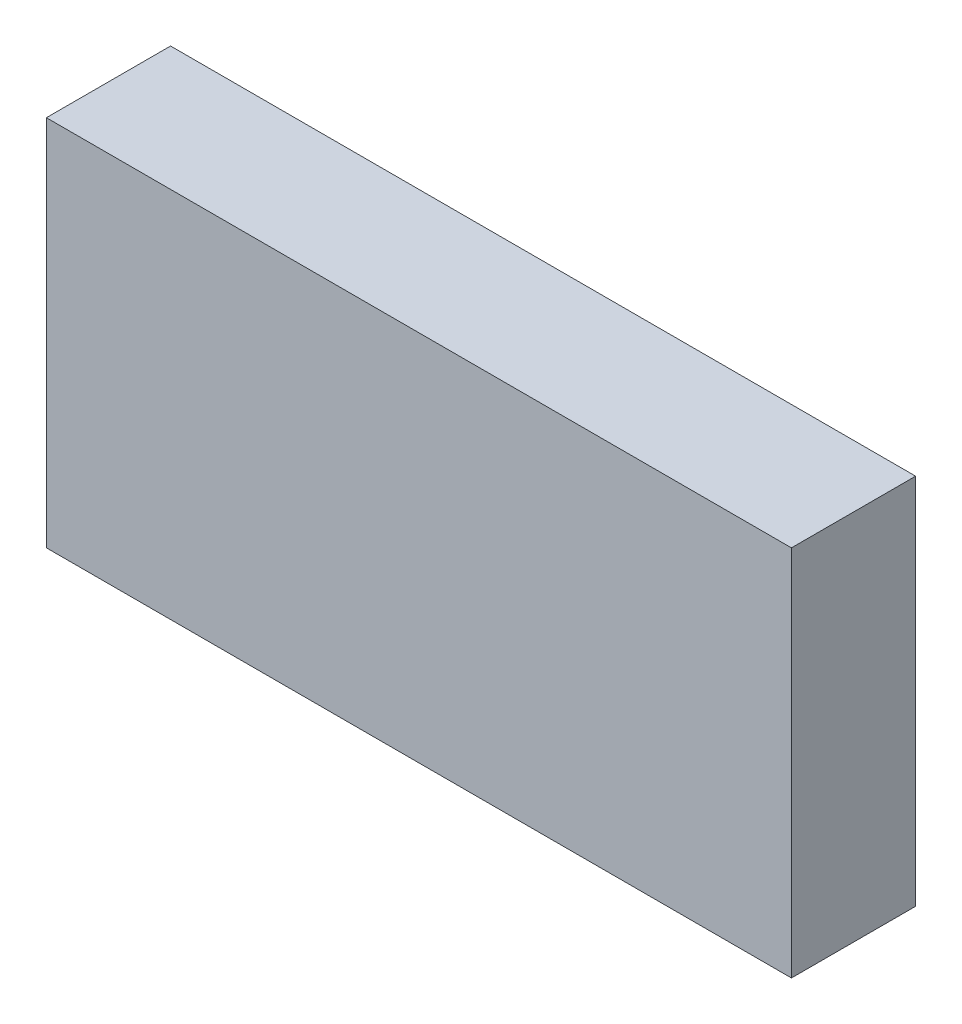
ISO-10303-21;
HEADER;
FILE_DESCRIPTION(('STEP AP214'),'2;1');
FILE_NAME('part.step','',(''),(''),'','','');
FILE_SCHEMA(('AUTOMOTIVE_DESIGN { 1 0 10303 214 1 1 1 1 }'));
ENDSEC;
DATA;
#1=APPLICATION_CONTEXT('core data for automotive mechanical design processes');
#2=APPLICATION_PROTOCOL_DEFINITION('international standard','automotive_design',2000,#1);
#3=PRODUCT_CONTEXT('',#1,'mechanical');
#4=PRODUCT('Part','Part','',(#3));
#5=PRODUCT_RELATED_PRODUCT_CATEGORY('part','',(#4));
#6=PRODUCT_DEFINITION_FORMATION('','',#4);
#7=PRODUCT_DEFINITION_CONTEXT('part definition',#1,'design');
#8=PRODUCT_DEFINITION('design','',#6,#7);
#9=PRODUCT_DEFINITION_SHAPE('','',#8);
#10=(LENGTH_UNIT() NAMED_UNIT(*) SI_UNIT(.MILLI.,.METRE.));
#11=(NAMED_UNIT(*) PLANE_ANGLE_UNIT() SI_UNIT($,.RADIAN.));
#12=(NAMED_UNIT(*) SI_UNIT($,.STERADIAN.) SOLID_ANGLE_UNIT());
#13=UNCERTAINTY_MEASURE_WITH_UNIT(LENGTH_MEASURE(1.E-05),#10,'distance_accuracy_value','');
#14=(GEOMETRIC_REPRESENTATION_CONTEXT(3) GLOBAL_UNCERTAINTY_ASSIGNED_CONTEXT((#13)) GLOBAL_UNIT_ASSIGNED_CONTEXT((#10,
#11,#12)) REPRESENTATION_CONTEXT('',''));
#15=CARTESIAN_POINT('',(0.,0.,0.));
#16=DIRECTION('',(0.,0.,1.));
#17=DIRECTION('',(1.,0.,0.));
#18=AXIS2_PLACEMENT_3D('',#15,#16,#17);
#19=CARTESIAN_POINT('',(0.,0.,2.));
#20=DIRECTION('',(1.,0.,0.));
#21=DIRECTION('',(0.,0.,-1.));
#22=AXIS2_PLACEMENT_3D('',#19,#20,#21);
#23=PLANE('',#22);
#24=DIRECTION('',(0.,-1.,0.));
#25=VECTOR('',#24,1.);
#26=CARTESIAN_POINT('',(0.,0.,0.));
#27=LINE('',#26,#25);
#28=CARTESIAN_POINT('',(0.,6.,0.));
#29=VERTEX_POINT('',#28);
#30=CARTESIAN_POINT('',(0.,0.,0.));
#31=VERTEX_POINT('',#30);
#32=EDGE_CURVE('E108',#29,#31,#27,.T.);
#33=ORIENTED_EDGE('',*,*,#32,.T.);
#34=DIRECTION('',(0.,0.,-1.));
#35=VECTOR('',#34,1.);
#36=CARTESIAN_POINT('',(0.,0.,2.));
#37=LINE('',#36,#35);
#38=CARTESIAN_POINT('',(0.,0.,2.));
#39=VERTEX_POINT('',#38);
#40=EDGE_CURVE('E11',#39,#31,#37,.T.);
#41=ORIENTED_EDGE('',*,*,#40,.F.);
#42=DIRECTION('',(0.,-1.,0.));
#43=VECTOR('',#42,1.);
#44=CARTESIAN_POINT('',(0.,0.,2.));
#45=LINE('',#44,#43);
#46=CARTESIAN_POINT('',(0.,6.,2.));
#47=VERTEX_POINT('',#46);
#48=EDGE_CURVE('E92',#47,#39,#45,.T.);
#49=ORIENTED_EDGE('',*,*,#48,.F.);
#50=DIRECTION('',(0.,0.,-1.));
#51=VECTOR('',#50,1.);
#52=CARTESIAN_POINT('',(0.,6.,2.));
#53=LINE('',#52,#51);
#54=EDGE_CURVE('E105',#47,#29,#53,.T.);
#55=ORIENTED_EDGE('',*,*,#54,.T.);
#56=EDGE_LOOP('',(#33,#41,#49,#55));
#57=FACE_BOUND('',#56,.T.);
#58=ADVANCED_FACE('F43',(#57),#23,.F.);
#59=CARTESIAN_POINT('',(0.,0.,2.));
#60=DIRECTION('',(0.,1.,0.));
#61=DIRECTION('',(0.,0.,1.));
#62=AXIS2_PLACEMENT_3D('',#59,#60,#61);
#63=PLANE('',#62);
#64=DIRECTION('',(1.,0.,0.));
#65=VECTOR('',#64,1.);
#66=CARTESIAN_POINT('',(0.,0.,0.));
#67=LINE('',#66,#65);
#68=CARTESIAN_POINT('',(12.,0.,0.));
#69=VERTEX_POINT('',#68);
#70=EDGE_CURVE('E97',#31,#69,#67,.T.);
#71=ORIENTED_EDGE('',*,*,#70,.T.);
#72=DIRECTION('',(0.,0.,-1.));
#73=VECTOR('',#72,1.);
#74=CARTESIAN_POINT('',(12.,0.,2.));
#75=LINE('',#74,#73);
#76=CARTESIAN_POINT('',(12.,0.,2.));
#77=VERTEX_POINT('',#76);
#78=EDGE_CURVE('E51',#77,#69,#75,.T.);
#79=ORIENTED_EDGE('',*,*,#78,.F.);
#80=DIRECTION('',(1.,0.,0.));
#81=VECTOR('',#80,1.);
#82=CARTESIAN_POINT('',(0.,0.,2.));
#83=LINE('',#82,#81);
#84=EDGE_CURVE('E87',#39,#77,#83,.T.);
#85=ORIENTED_EDGE('',*,*,#84,.F.);
#86=ORIENTED_EDGE('',*,*,#40,.T.);
#87=EDGE_LOOP('',(#71,#79,#85,#86));
#88=FACE_BOUND('',#87,.T.);
#89=ADVANCED_FACE('F100',(#88),#63,.F.);
#90=CARTESIAN_POINT('',(12.,0.,2.));
#91=DIRECTION('',(-1.,0.,0.));
#92=DIRECTION('',(0.,0.,1.));
#93=AXIS2_PLACEMENT_3D('',#90,#91,#92);
#94=PLANE('',#93);
#95=DIRECTION('',(0.,1.,0.));
#96=VECTOR('',#95,1.);
#97=CARTESIAN_POINT('',(12.,0.,0.));
#98=LINE('',#97,#96);
#99=CARTESIAN_POINT('',(12.,6.,0.));
#100=VERTEX_POINT('',#99);
#101=EDGE_CURVE('E78',#69,#100,#98,.T.);
#102=ORIENTED_EDGE('',*,*,#101,.T.);
#103=DIRECTION('',(0.,0.,-1.));
#104=VECTOR('',#103,1.);
#105=CARTESIAN_POINT('',(12.,6.,2.));
#106=LINE('',#105,#104);
#107=CARTESIAN_POINT('',(12.,6.,2.));
#108=VERTEX_POINT('',#107);
#109=EDGE_CURVE('E98',#108,#100,#106,.T.);
#110=ORIENTED_EDGE('',*,*,#109,.F.);
#111=DIRECTION('',(0.,1.,0.));
#112=VECTOR('',#111,1.);
#113=CARTESIAN_POINT('',(12.,0.,2.));
#114=LINE('',#113,#112);
#115=EDGE_CURVE('E95',#77,#108,#114,.T.);
#116=ORIENTED_EDGE('',*,*,#115,.F.);
#117=ORIENTED_EDGE('',*,*,#78,.T.);
#118=EDGE_LOOP('',(#102,#110,#116,#117));
#119=FACE_BOUND('',#118,.T.);
#120=ADVANCED_FACE('F99',(#119),#94,.F.);
#121=CARTESIAN_POINT('',(0.,6.,2.));
#122=DIRECTION('',(0.,-1.,0.));
#123=DIRECTION('',(0.,0.,-1.));
#124=AXIS2_PLACEMENT_3D('',#121,#122,#123);
#125=PLANE('',#124);
#126=DIRECTION('',(-1.,0.,0.));
#127=VECTOR('',#126,1.);
#128=CARTESIAN_POINT('',(0.,6.,0.));
#129=LINE('',#128,#127);
#130=EDGE_CURVE('E85',#100,#29,#129,.T.);
#131=ORIENTED_EDGE('',*,*,#130,.T.);
#132=ORIENTED_EDGE('',*,*,#54,.F.);
#133=DIRECTION('',(-1.,0.,0.));
#134=VECTOR('',#133,1.);
#135=CARTESIAN_POINT('',(0.,6.,2.));
#136=LINE('',#135,#134);
#137=EDGE_CURVE('E56',#108,#47,#136,.T.);
#138=ORIENTED_EDGE('',*,*,#137,.F.);
#139=ORIENTED_EDGE('',*,*,#109,.T.);
#140=EDGE_LOOP('',(#131,#132,#138,#139));
#141=FACE_BOUND('',#140,.T.);
#142=ADVANCED_FACE('F111',(#141),#125,.F.);
#143=CARTESIAN_POINT('',(0.,0.,2.));
#144=DIRECTION('',(0.,0.,-1.));
#145=DIRECTION('',(-1.,0.,0.));
#146=AXIS2_PLACEMENT_3D('',#143,#144,#145);
#147=PLANE('',#146);
#148=ORIENTED_EDGE('',*,*,#48,.T.);
#149=ORIENTED_EDGE('',*,*,#84,.T.);
#150=ORIENTED_EDGE('',*,*,#115,.T.);
#151=ORIENTED_EDGE('',*,*,#137,.T.);
#152=EDGE_LOOP('',(#148,#149,#150,#151));
#153=FACE_BOUND('',#152,.T.);
#154=ADVANCED_FACE('F89',(#153),#147,.F.);
#155=CARTESIAN_POINT('',(0.,0.,0.));
#156=DIRECTION('',(0.,0.,-1.));
#157=DIRECTION('',(-1.,0.,0.));
#158=AXIS2_PLACEMENT_3D('',#155,#156,#157);
#159=PLANE('',#158);
#160=ORIENTED_EDGE('',*,*,#32,.F.);
#161=ORIENTED_EDGE('',*,*,#130,.F.);
#162=ORIENTED_EDGE('',*,*,#101,.F.);
#163=ORIENTED_EDGE('',*,*,#70,.F.);
#164=EDGE_LOOP('',(#160,#161,#162,#163));
#165=FACE_BOUND('',#164,.T.);
#166=ADVANCED_FACE('F118',(#165),#159,.T.);
#167=CLOSED_SHELL('',(#58,#89,#120,#142,#154,#166));
#168=MANIFOLD_SOLID_BREP('B2',#167);
#169=ADVANCED_BREP_SHAPE_REPRESENTATION('',(#18,#168),#14);
#170=SHAPE_DEFINITION_REPRESENTATION(#9,#169);
ENDSEC;
END-ISO-10303-21;
